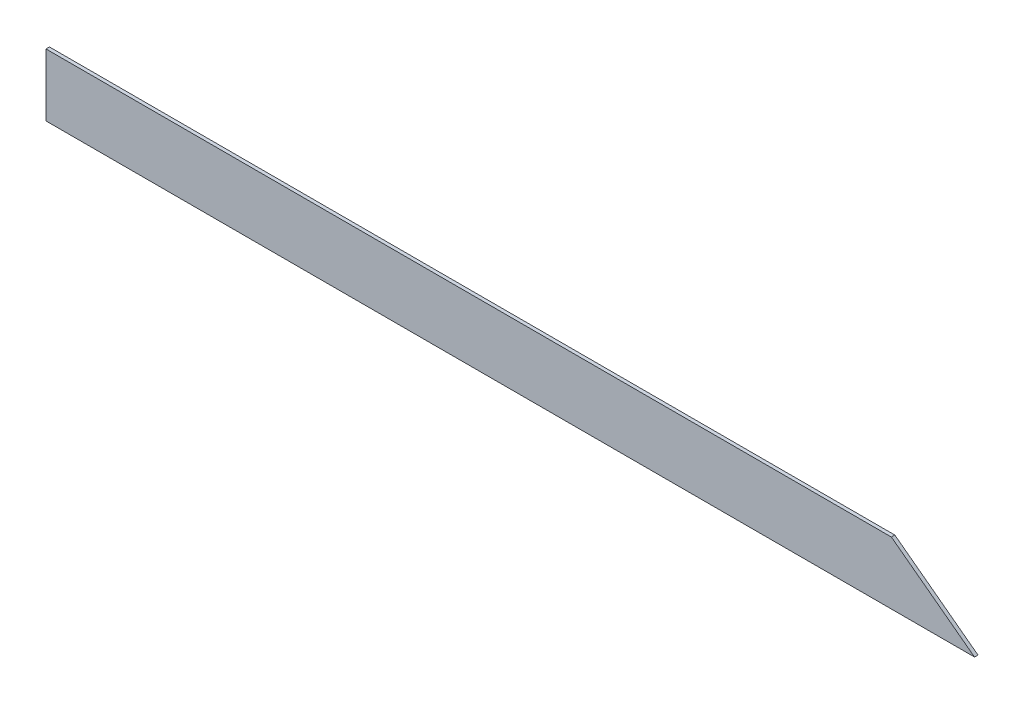
ISO-10303-21;
HEADER;
FILE_DESCRIPTION(('STEP AP214'),'2;1');
FILE_NAME('part.step','',(''),(''),'','','');
FILE_SCHEMA(('AUTOMOTIVE_DESIGN { 1 0 10303 214 1 1 1 1 }'));
ENDSEC;
DATA;
#1=APPLICATION_CONTEXT('core data for automotive mechanical design processes');
#2=APPLICATION_PROTOCOL_DEFINITION('international standard','automotive_design',2000,#1);
#3=PRODUCT_CONTEXT('',#1,'mechanical');
#4=PRODUCT('Part','Part','',(#3));
#5=PRODUCT_RELATED_PRODUCT_CATEGORY('part','',(#4));
#6=PRODUCT_DEFINITION_FORMATION('','',#4);
#7=PRODUCT_DEFINITION_CONTEXT('part definition',#1,'design');
#8=PRODUCT_DEFINITION('design','',#6,#7);
#9=PRODUCT_DEFINITION_SHAPE('','',#8);
#10=(LENGTH_UNIT() NAMED_UNIT(*) SI_UNIT(.MILLI.,.METRE.));
#11=(NAMED_UNIT(*) PLANE_ANGLE_UNIT() SI_UNIT($,.RADIAN.));
#12=(NAMED_UNIT(*) SI_UNIT($,.STERADIAN.) SOLID_ANGLE_UNIT());
#13=UNCERTAINTY_MEASURE_WITH_UNIT(LENGTH_MEASURE(1.E-05),#10,'distance_accuracy_value','');
#14=(GEOMETRIC_REPRESENTATION_CONTEXT(3) GLOBAL_UNCERTAINTY_ASSIGNED_CONTEXT((#13)) GLOBAL_UNIT_ASSIGNED_CONTEXT((#10,
#11,#12)) REPRESENTATION_CONTEXT('',''));
#15=CARTESIAN_POINT('',(0.,0.,0.));
#16=DIRECTION('',(0.,0.,1.));
#17=DIRECTION('',(1.,0.,0.));
#18=AXIS2_PLACEMENT_3D('',#15,#16,#17);
#19=CARTESIAN_POINT('',(0.,28.575,1.5875));
#20=DIRECTION('',(1.,0.,0.));
#21=DIRECTION('',(0.,1.,0.));
#22=AXIS2_PLACEMENT_3D('',#19,#20,#21);
#23=PLANE('',#22);
#24=DIRECTION('',(0.,-1.,0.));
#25=VECTOR('',#24,1.);
#26=CARTESIAN_POINT('',(0.,28.575,0.));
#27=LINE('',#26,#25);
#28=CARTESIAN_POINT('',(0.,28.575,0.));
#29=VERTEX_POINT('',#28);
#30=CARTESIAN_POINT('',(0.,0.,0.));
#31=VERTEX_POINT('',#30);
#32=EDGE_CURVE('E97',#29,#31,#27,.T.);
#33=ORIENTED_EDGE('',*,*,#32,.T.);
#34=DIRECTION('',(0.,0.,-1.));
#35=VECTOR('',#34,1.);
#36=CARTESIAN_POINT('',(0.,0.,1.5875));
#37=LINE('',#36,#35);
#38=CARTESIAN_POINT('',(0.,0.,1.5875));
#39=VERTEX_POINT('',#38);
#40=EDGE_CURVE('E11',#39,#31,#37,.T.);
#41=ORIENTED_EDGE('',*,*,#40,.F.);
#42=DIRECTION('',(0.,-1.,0.));
#43=VECTOR('',#42,1.);
#44=CARTESIAN_POINT('',(0.,28.575,1.5875));
#45=LINE('',#44,#43);
#46=CARTESIAN_POINT('',(0.,28.575,1.5875));
#47=VERTEX_POINT('',#46);
#48=EDGE_CURVE('E85',#47,#39,#45,.T.);
#49=ORIENTED_EDGE('',*,*,#48,.F.);
#50=DIRECTION('',(0.,0.,-1.));
#51=VECTOR('',#50,1.);
#52=CARTESIAN_POINT('',(0.,28.575,1.5875));
#53=LINE('',#52,#51);
#54=EDGE_CURVE('E93',#47,#29,#53,.T.);
#55=ORIENTED_EDGE('',*,*,#54,.T.);
#56=EDGE_LOOP('',(#33,#41,#49,#55));
#57=FACE_BOUND('',#56,.T.);
#58=ADVANCED_FACE('F34',(#57),#23,.F.);
#59=CARTESIAN_POINT('',(0.,0.,1.5875));
#60=DIRECTION('',(0.,1.,0.));
#61=DIRECTION('',(0.,0.,1.));
#62=AXIS2_PLACEMENT_3D('',#59,#60,#61);
#63=PLANE('',#62);
#64=DIRECTION('',(1.,0.,0.));
#65=VECTOR('',#64,1.);
#66=CARTESIAN_POINT('',(0.,0.,0.));
#67=LINE('',#66,#65);
#68=CARTESIAN_POINT('',(425.45,0.,0.));
#69=VERTEX_POINT('',#68);
#70=EDGE_CURVE('E89',#31,#69,#67,.T.);
#71=ORIENTED_EDGE('',*,*,#70,.T.);
#72=DIRECTION('',(0.,0.,-1.));
#73=VECTOR('',#72,1.);
#74=CARTESIAN_POINT('',(425.45,0.,1.5875));
#75=LINE('',#74,#73);
#76=CARTESIAN_POINT('',(425.45,0.,1.5875));
#77=VERTEX_POINT('',#76);
#78=EDGE_CURVE('E42',#77,#69,#75,.T.);
#79=ORIENTED_EDGE('',*,*,#78,.F.);
#80=DIRECTION('',(1.,0.,0.));
#81=VECTOR('',#80,1.);
#82=CARTESIAN_POINT('',(0.,0.,1.5875));
#83=LINE('',#82,#81);
#84=EDGE_CURVE('E80',#39,#77,#83,.T.);
#85=ORIENTED_EDGE('',*,*,#84,.F.);
#86=ORIENTED_EDGE('',*,*,#40,.T.);
#87=EDGE_LOOP('',(#71,#79,#85,#86));
#88=FACE_BOUND('',#87,.T.);
#89=ADVANCED_FACE('F88',(#88),#63,.F.);
#90=CARTESIAN_POINT('',(425.45,0.,1.5875));
#91=DIRECTION('',(-0.6,-0.8,0.));
#92=DIRECTION('',(0.8,-0.6,0.));
#93=AXIS2_PLACEMENT_3D('',#90,#91,#92);
#94=PLANE('',#93);
#95=DIRECTION('',(-0.8,0.6,0.));
#96=VECTOR('',#95,1.);
#97=CARTESIAN_POINT('',(425.45,0.,0.));
#98=LINE('',#97,#96);
#99=CARTESIAN_POINT('',(387.35,28.575,0.));
#100=VERTEX_POINT('',#99);
#101=EDGE_CURVE('E67',#69,#100,#98,.T.);
#102=ORIENTED_EDGE('',*,*,#101,.T.);
#103=DIRECTION('',(0.,0.,-1.));
#104=VECTOR('',#103,1.);
#105=CARTESIAN_POINT('',(387.35,28.575,1.5875));
#106=LINE('',#105,#104);
#107=CARTESIAN_POINT('',(387.35,28.575,1.5875));
#108=VERTEX_POINT('',#107);
#109=EDGE_CURVE('E90',#108,#100,#106,.T.);
#110=ORIENTED_EDGE('',*,*,#109,.F.);
#111=DIRECTION('',(-0.8,0.6,0.));
#112=VECTOR('',#111,1.);
#113=CARTESIAN_POINT('',(425.45,0.,1.5875));
#114=LINE('',#113,#112);
#115=EDGE_CURVE('E83',#77,#108,#114,.T.);
#116=ORIENTED_EDGE('',*,*,#115,.F.);
#117=ORIENTED_EDGE('',*,*,#78,.T.);
#118=EDGE_LOOP('',(#102,#110,#116,#117));
#119=FACE_BOUND('',#118,.T.);
#120=ADVANCED_FACE('F91',(#119),#94,.F.);
#121=CARTESIAN_POINT('',(387.35,28.575,1.5875));
#122=DIRECTION('',(0.,-1.,0.));
#123=DIRECTION('',(1.,0.,0.));
#124=AXIS2_PLACEMENT_3D('',#121,#122,#123);
#125=PLANE('',#124);
#126=DIRECTION('',(-1.,0.,0.));
#127=VECTOR('',#126,1.);
#128=CARTESIAN_POINT('',(387.35,28.575,0.));
#129=LINE('',#128,#127);
#130=EDGE_CURVE('E73',#100,#29,#129,.T.);
#131=ORIENTED_EDGE('',*,*,#130,.T.);
#132=ORIENTED_EDGE('',*,*,#54,.F.);
#133=DIRECTION('',(-1.,0.,0.));
#134=VECTOR('',#133,1.);
#135=CARTESIAN_POINT('',(387.35,28.575,1.5875));
#136=LINE('',#135,#134);
#137=EDGE_CURVE('E50',#108,#47,#136,.T.);
#138=ORIENTED_EDGE('',*,*,#137,.F.);
#139=ORIENTED_EDGE('',*,*,#109,.T.);
#140=EDGE_LOOP('',(#131,#132,#138,#139));
#141=FACE_BOUND('',#140,.T.);
#142=ADVANCED_FACE('F104',(#141),#125,.F.);
#143=CARTESIAN_POINT('',(0.,0.,1.5875));
#144=DIRECTION('',(0.,0.,1.));
#145=DIRECTION('',(1.,0.,0.));
#146=AXIS2_PLACEMENT_3D('',#143,#144,#145);
#147=PLANE('',#146);
#148=ORIENTED_EDGE('',*,*,#48,.T.);
#149=ORIENTED_EDGE('',*,*,#84,.T.);
#150=ORIENTED_EDGE('',*,*,#115,.T.);
#151=ORIENTED_EDGE('',*,*,#137,.T.);
#152=EDGE_LOOP('',(#148,#149,#150,#151));
#153=FACE_BOUND('',#152,.T.);
#154=ADVANCED_FACE('F81',(#153),#147,.T.);
#155=CARTESIAN_POINT('',(0.,0.,0.));
#156=DIRECTION('',(0.,0.,1.));
#157=DIRECTION('',(1.,0.,0.));
#158=AXIS2_PLACEMENT_3D('',#155,#156,#157);
#159=PLANE('',#158);
#160=ORIENTED_EDGE('',*,*,#32,.F.);
#161=ORIENTED_EDGE('',*,*,#130,.F.);
#162=ORIENTED_EDGE('',*,*,#101,.F.);
#163=ORIENTED_EDGE('',*,*,#70,.F.);
#164=EDGE_LOOP('',(#160,#161,#162,#163));
#165=FACE_BOUND('',#164,.T.);
#166=ADVANCED_FACE('F107',(#165),#159,.F.);
#167=CLOSED_SHELL('',(#58,#89,#120,#142,#154,#166));
#168=MANIFOLD_SOLID_BREP('B2',#167);
#169=ADVANCED_BREP_SHAPE_REPRESENTATION('',(#18,#168),#14);
#170=SHAPE_DEFINITION_REPRESENTATION(#9,#169);
ENDSEC;
END-ISO-10303-21;
